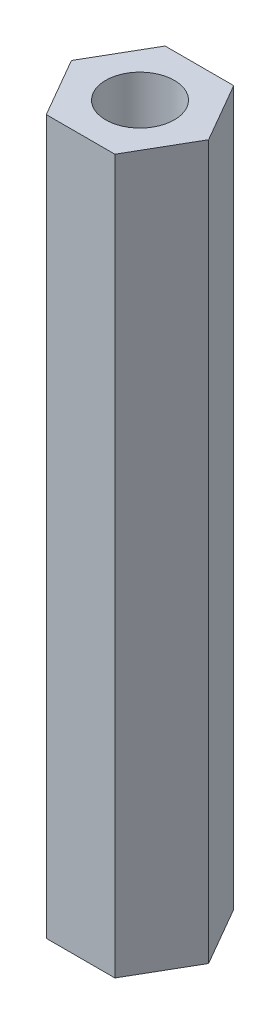
ISO-10303-21;
HEADER;
FILE_DESCRIPTION(('STEP AP214'),'2;1');
FILE_NAME('part.step','',(''),(''),'','','');
FILE_SCHEMA(('AUTOMOTIVE_DESIGN { 1 0 10303 214 1 1 1 1 }'));
ENDSEC;
DATA;
#1=APPLICATION_CONTEXT('core data for automotive mechanical design processes');
#2=APPLICATION_PROTOCOL_DEFINITION('international standard','automotive_design',2000,#1);
#3=PRODUCT_CONTEXT('',#1,'mechanical');
#4=PRODUCT('Part','Part','',(#3));
#5=PRODUCT_RELATED_PRODUCT_CATEGORY('part','',(#4));
#6=PRODUCT_DEFINITION_FORMATION('','',#4);
#7=PRODUCT_DEFINITION_CONTEXT('part definition',#1,'design');
#8=PRODUCT_DEFINITION('design','',#6,#7);
#9=PRODUCT_DEFINITION_SHAPE('','',#8);
#10=(LENGTH_UNIT() NAMED_UNIT(*) SI_UNIT(.MILLI.,.METRE.));
#11=(NAMED_UNIT(*) PLANE_ANGLE_UNIT() SI_UNIT($,.RADIAN.));
#12=(NAMED_UNIT(*) SI_UNIT($,.STERADIAN.) SOLID_ANGLE_UNIT());
#13=UNCERTAINTY_MEASURE_WITH_UNIT(LENGTH_MEASURE(1.E-05),#10,'distance_accuracy_value','');
#14=(GEOMETRIC_REPRESENTATION_CONTEXT(3) GLOBAL_UNCERTAINTY_ASSIGNED_CONTEXT((#13)) GLOBAL_UNIT_ASSIGNED_CONTEXT((#10,
#11,#12)) REPRESENTATION_CONTEXT('',''));
#15=CARTESIAN_POINT('',(0.,0.,0.));
#16=DIRECTION('',(0.,0.,1.));
#17=DIRECTION('',(1.,0.,0.));
#18=AXIS2_PLACEMENT_3D('',#15,#16,#17);
#19=CARTESIAN_POINT('',(0.,13.,0.));
#20=DIRECTION('',(0.,1.,0.));
#21=DIRECTION('',(0.,0.,1.));
#22=AXIS2_PLACEMENT_3D('',#19,#20,#21);
#23=PLANE('',#22);
#24=DIRECTION('',(1.,0.,0.));
#25=VECTOR('',#24,1.);
#26=CARTESIAN_POINT('',(-1.25,13.,2.1650635094611));
#27=LINE('',#26,#25);
#28=CARTESIAN_POINT('',(-1.25,13.,2.1650635094611));
#29=VERTEX_POINT('',#28);
#30=CARTESIAN_POINT('',(1.25,13.,2.1650635094611));
#31=VERTEX_POINT('',#30);
#32=EDGE_CURVE('E130',#29,#31,#27,.T.);
#33=ORIENTED_EDGE('',*,*,#32,.T.);
#34=DIRECTION('',(0.5,0.,-0.866025403784439));
#35=VECTOR('',#34,1.);
#36=CARTESIAN_POINT('',(1.25,13.,2.1650635094611));
#37=LINE('',#36,#35);
#38=CARTESIAN_POINT('',(2.5,13.,0.));
#39=VERTEX_POINT('',#38);
#40=EDGE_CURVE('E88',#31,#39,#37,.T.);
#41=ORIENTED_EDGE('',*,*,#40,.T.);
#42=DIRECTION('',(-0.5,0.,-0.866025403784438));
#43=VECTOR('',#42,1.);
#44=CARTESIAN_POINT('',(2.5,13.,0.));
#45=LINE('',#44,#43);
#46=CARTESIAN_POINT('',(1.25,13.,-2.1650635094611));
#47=VERTEX_POINT('',#46);
#48=EDGE_CURVE('E101',#39,#47,#45,.T.);
#49=ORIENTED_EDGE('',*,*,#48,.T.);
#50=DIRECTION('',(-1.,0.,0.));
#51=VECTOR('',#50,1.);
#52=CARTESIAN_POINT('',(1.25,13.,-2.1650635094611));
#53=LINE('',#52,#51);
#54=CARTESIAN_POINT('',(-1.25,13.,-2.1650635094611));
#55=VERTEX_POINT('',#54);
#56=EDGE_CURVE('E95',#47,#55,#53,.T.);
#57=ORIENTED_EDGE('',*,*,#56,.T.);
#58=DIRECTION('',(-0.5,0.,0.866025403784439));
#59=VECTOR('',#58,1.);
#60=CARTESIAN_POINT('',(-1.25,13.,-2.1650635094611));
#61=LINE('',#60,#59);
#62=CARTESIAN_POINT('',(-2.5,13.,0.));
#63=VERTEX_POINT('',#62);
#64=EDGE_CURVE('E99',#55,#63,#61,.T.);
#65=ORIENTED_EDGE('',*,*,#64,.T.);
#66=DIRECTION('',(0.5,0.,0.866025403784439));
#67=VECTOR('',#66,1.);
#68=CARTESIAN_POINT('',(-2.5,13.,0.));
#69=LINE('',#68,#67);
#70=EDGE_CURVE('E51',#63,#29,#69,.T.);
#71=ORIENTED_EDGE('',*,*,#70,.T.);
#72=EDGE_LOOP('',(#33,#41,#49,#57,#65,#71));
#73=FACE_BOUND('',#72,.T.);
#74=CARTESIAN_POINT('',(0.,13.,0.));
#75=DIRECTION('',(0.,1.,0.));
#76=DIRECTION('',(0.,0.,1.));
#77=AXIS2_PLACEMENT_3D('',#74,#75,#76);
#78=CIRCLE('',#77,1.25);
#79=CARTESIAN_POINT('',(0.,13.,-1.25));
#80=VERTEX_POINT('',#79);
#81=EDGE_CURVE('E123',#80,#80,#78,.T.);
#82=ORIENTED_EDGE('',*,*,#81,.F.);
#83=EDGE_LOOP('',(#82));
#84=FACE_BOUND('',#83,.T.);
#85=ADVANCED_FACE('F34',(#73,#84),#23,.T.);
#86=CARTESIAN_POINT('',(0.,-13.,0.));
#87=DIRECTION('',(0.,1.,0.));
#88=DIRECTION('',(0.,0.,1.));
#89=AXIS2_PLACEMENT_3D('',#86,#87,#88);
#90=PLANE('',#89);
#91=DIRECTION('',(1.,0.,0.));
#92=VECTOR('',#91,1.);
#93=CARTESIAN_POINT('',(-1.25,-13.,2.1650635094611));
#94=LINE('',#93,#92);
#95=CARTESIAN_POINT('',(-1.25,-13.,2.1650635094611));
#96=VERTEX_POINT('',#95);
#97=CARTESIAN_POINT('',(1.25,-13.,2.1650635094611));
#98=VERTEX_POINT('',#97);
#99=EDGE_CURVE('E119',#96,#98,#94,.T.);
#100=ORIENTED_EDGE('',*,*,#99,.F.);
#101=DIRECTION('',(0.5,0.,0.866025403784439));
#102=VECTOR('',#101,1.);
#103=CARTESIAN_POINT('',(-2.5,-13.,0.));
#104=LINE('',#103,#102);
#105=CARTESIAN_POINT('',(-2.5,-13.,0.));
#106=VERTEX_POINT('',#105);
#107=EDGE_CURVE('E80',#106,#96,#104,.T.);
#108=ORIENTED_EDGE('',*,*,#107,.F.);
#109=DIRECTION('',(-0.5,0.,0.866025403784439));
#110=VECTOR('',#109,1.);
#111=CARTESIAN_POINT('',(-1.25,-13.,-2.1650635094611));
#112=LINE('',#111,#110);
#113=CARTESIAN_POINT('',(-1.25,-13.,-2.1650635094611));
#114=VERTEX_POINT('',#113);
#115=EDGE_CURVE('E74',#114,#106,#112,.T.);
#116=ORIENTED_EDGE('',*,*,#115,.F.);
#117=DIRECTION('',(-1.,0.,0.));
#118=VECTOR('',#117,1.);
#119=CARTESIAN_POINT('',(1.25,-13.,-2.1650635094611));
#120=LINE('',#119,#118);
#121=CARTESIAN_POINT('',(1.25,-13.,-2.1650635094611));
#122=VERTEX_POINT('',#121);
#123=EDGE_CURVE('E109',#122,#114,#120,.T.);
#124=ORIENTED_EDGE('',*,*,#123,.F.);
#125=DIRECTION('',(-0.5,0.,-0.866025403784438));
#126=VECTOR('',#125,1.);
#127=CARTESIAN_POINT('',(2.5,-13.,0.));
#128=LINE('',#127,#126);
#129=CARTESIAN_POINT('',(2.5,-13.,0.));
#130=VERTEX_POINT('',#129);
#131=EDGE_CURVE('E125',#130,#122,#128,.T.);
#132=ORIENTED_EDGE('',*,*,#131,.F.);
#133=DIRECTION('',(0.5,0.,-0.866025403784439));
#134=VECTOR('',#133,1.);
#135=CARTESIAN_POINT('',(1.25,-13.,2.1650635094611));
#136=LINE('',#135,#134);
#137=EDGE_CURVE('E122',#98,#130,#136,.T.);
#138=ORIENTED_EDGE('',*,*,#137,.F.);
#139=EDGE_LOOP('',(#100,#108,#116,#124,#132,#138));
#140=FACE_BOUND('',#139,.T.);
#141=CARTESIAN_POINT('',(0.,-13.,0.));
#142=DIRECTION('',(0.,1.,0.));
#143=DIRECTION('',(0.,0.,1.));
#144=AXIS2_PLACEMENT_3D('',#141,#142,#143);
#145=CIRCLE('',#144,1.25);
#146=CARTESIAN_POINT('',(0.,-13.,-1.25));
#147=VERTEX_POINT('',#146);
#148=EDGE_CURVE('E223',#147,#147,#145,.T.);
#149=ORIENTED_EDGE('',*,*,#148,.T.);
#150=EDGE_LOOP('',(#149));
#151=FACE_BOUND('',#150,.T.);
#152=ADVANCED_FACE('F139',(#140,#151),#90,.F.);
#153=CARTESIAN_POINT('',(-1.25,13.,2.1650635094611));
#154=DIRECTION('',(0.,0.,-1.));
#155=DIRECTION('',(-1.,0.,0.));
#156=AXIS2_PLACEMENT_3D('',#153,#154,#155);
#157=PLANE('',#156);
#158=ORIENTED_EDGE('',*,*,#99,.T.);
#159=DIRECTION('',(0.,-1.,0.));
#160=VECTOR('',#159,1.);
#161=CARTESIAN_POINT('',(1.25,13.,2.1650635094611));
#162=LINE('',#161,#160);
#163=EDGE_CURVE('E11',#31,#98,#162,.T.);
#164=ORIENTED_EDGE('',*,*,#163,.F.);
#165=ORIENTED_EDGE('',*,*,#32,.F.);
#166=DIRECTION('',(0.,-1.,0.));
#167=VECTOR('',#166,1.);
#168=CARTESIAN_POINT('',(-1.25,13.,2.1650635094611));
#169=LINE('',#168,#167);
#170=EDGE_CURVE('E115',#29,#96,#169,.T.);
#171=ORIENTED_EDGE('',*,*,#170,.T.);
#172=EDGE_LOOP('',(#158,#164,#165,#171));
#173=FACE_BOUND('',#172,.T.);
#174=ADVANCED_FACE('F36',(#173),#157,.F.);
#175=CARTESIAN_POINT('',(1.25,13.,2.1650635094611));
#176=DIRECTION('',(-0.866025403784438,0.,-0.5));
#177=DIRECTION('',(-0.5,0.,0.866025403784439));
#178=AXIS2_PLACEMENT_3D('',#175,#176,#177);
#179=PLANE('',#178);
#180=ORIENTED_EDGE('',*,*,#137,.T.);
#181=DIRECTION('',(0.,-1.,0.));
#182=VECTOR('',#181,1.);
#183=CARTESIAN_POINT('',(2.5,13.,0.));
#184=LINE('',#183,#182);
#185=EDGE_CURVE('E43',#39,#130,#184,.T.);
#186=ORIENTED_EDGE('',*,*,#185,.F.);
#187=ORIENTED_EDGE('',*,*,#40,.F.);
#188=ORIENTED_EDGE('',*,*,#163,.T.);
#189=EDGE_LOOP('',(#180,#186,#187,#188));
#190=FACE_BOUND('',#189,.T.);
#191=ADVANCED_FACE('F164',(#190),#179,.F.);
#192=CARTESIAN_POINT('',(2.5,13.,0.));
#193=DIRECTION('',(-0.866025403784438,0.,0.5));
#194=DIRECTION('',(0.5,0.,0.866025403784439));
#195=AXIS2_PLACEMENT_3D('',#192,#193,#194);
#196=PLANE('',#195);
#197=ORIENTED_EDGE('',*,*,#131,.T.);
#198=DIRECTION('',(0.,-1.,0.));
#199=VECTOR('',#198,1.);
#200=CARTESIAN_POINT('',(1.25,13.,-2.1650635094611));
#201=LINE('',#200,#199);
#202=EDGE_CURVE('E110',#47,#122,#201,.T.);
#203=ORIENTED_EDGE('',*,*,#202,.F.);
#204=ORIENTED_EDGE('',*,*,#48,.F.);
#205=ORIENTED_EDGE('',*,*,#185,.T.);
#206=EDGE_LOOP('',(#197,#203,#204,#205));
#207=FACE_BOUND('',#206,.T.);
#208=ADVANCED_FACE('F136',(#207),#196,.F.);
#209=CARTESIAN_POINT('',(1.25,13.,-2.1650635094611));
#210=DIRECTION('',(0.,0.,1.));
#211=DIRECTION('',(1.,0.,0.));
#212=AXIS2_PLACEMENT_3D('',#209,#210,#211);
#213=PLANE('',#212);
#214=ORIENTED_EDGE('',*,*,#123,.T.);
#215=DIRECTION('',(0.,-1.,0.));
#216=VECTOR('',#215,1.);
#217=CARTESIAN_POINT('',(-1.25,13.,-2.1650635094611));
#218=LINE('',#217,#216);
#219=EDGE_CURVE('E106',#55,#114,#218,.T.);
#220=ORIENTED_EDGE('',*,*,#219,.F.);
#221=ORIENTED_EDGE('',*,*,#56,.F.);
#222=ORIENTED_EDGE('',*,*,#202,.T.);
#223=EDGE_LOOP('',(#214,#220,#221,#222));
#224=FACE_BOUND('',#223,.T.);
#225=ADVANCED_FACE('F107',(#224),#213,.F.);
#226=CARTESIAN_POINT('',(-1.25,13.,-2.1650635094611));
#227=DIRECTION('',(0.866025403784439,0.,0.5));
#228=DIRECTION('',(0.5,0.,-0.866025403784439));
#229=AXIS2_PLACEMENT_3D('',#226,#227,#228);
#230=PLANE('',#229);
#231=ORIENTED_EDGE('',*,*,#115,.T.);
#232=DIRECTION('',(0.,-1.,0.));
#233=VECTOR('',#232,1.);
#234=CARTESIAN_POINT('',(-2.5,13.,0.));
#235=LINE('',#234,#233);
#236=EDGE_CURVE('E111',#63,#106,#235,.T.);
#237=ORIENTED_EDGE('',*,*,#236,.F.);
#238=ORIENTED_EDGE('',*,*,#64,.F.);
#239=ORIENTED_EDGE('',*,*,#219,.T.);
#240=EDGE_LOOP('',(#231,#237,#238,#239));
#241=FACE_BOUND('',#240,.T.);
#242=ADVANCED_FACE('F113',(#241),#230,.F.);
#243=CARTESIAN_POINT('',(-2.5,13.,0.));
#244=DIRECTION('',(0.866025403784438,0.,-0.5));
#245=DIRECTION('',(-0.5,0.,-0.866025403784439));
#246=AXIS2_PLACEMENT_3D('',#243,#244,#245);
#247=PLANE('',#246);
#248=ORIENTED_EDGE('',*,*,#107,.T.);
#249=ORIENTED_EDGE('',*,*,#170,.F.);
#250=ORIENTED_EDGE('',*,*,#70,.F.);
#251=ORIENTED_EDGE('',*,*,#236,.T.);
#252=EDGE_LOOP('',(#248,#249,#250,#251));
#253=FACE_BOUND('',#252,.T.);
#254=ADVANCED_FACE('F144',(#253),#247,.F.);
#255=CARTESIAN_POINT('',(0.,13.,0.));
#256=DIRECTION('',(0.,-1.,0.));
#257=DIRECTION('',(0.,0.,-1.));
#258=AXIS2_PLACEMENT_3D('',#255,#256,#257);
#259=CYLINDRICAL_SURFACE('',#258,1.25);
#260=CARTESIAN_POINT('',(0.,13.,-1.25));
#261=CARTESIAN_POINT('',(0.,12.7291666666667,-1.25));
#262=CARTESIAN_POINT('',(0.,12.4583333333333,-1.25));
#263=CARTESIAN_POINT('',(0.,11.9166666666667,-1.25));
#264=CARTESIAN_POINT('',(0.,11.6458333333333,-1.25));
#265=CARTESIAN_POINT('',(0.,11.1041666666667,-1.25));
#266=CARTESIAN_POINT('',(0.,10.8333333333333,-1.25));
#267=CARTESIAN_POINT('',(0.,10.2916666666667,-1.25));
#268=CARTESIAN_POINT('',(0.,10.0208333333333,-1.25));
#269=CARTESIAN_POINT('',(0.,9.47916666666667,-1.25));
#270=CARTESIAN_POINT('',(0.,9.20833333333333,-1.25));
#271=CARTESIAN_POINT('',(0.,8.66666666666667,-1.25));
#272=CARTESIAN_POINT('',(0.,8.39583333333333,-1.25));
#273=CARTESIAN_POINT('',(0.,7.85416666666667,-1.25));
#274=CARTESIAN_POINT('',(0.,7.58333333333333,-1.25));
#275=CARTESIAN_POINT('',(0.,7.04166666666667,-1.25));
#276=CARTESIAN_POINT('',(0.,6.77083333333333,-1.25));
#277=CARTESIAN_POINT('',(0.,6.22916666666667,-1.25));
#278=CARTESIAN_POINT('',(0.,5.95833333333333,-1.25));
#279=CARTESIAN_POINT('',(0.,5.41666666666667,-1.25));
#280=CARTESIAN_POINT('',(0.,5.14583333333333,-1.25));
#281=CARTESIAN_POINT('',(0.,4.60416666666667,-1.25));
#282=CARTESIAN_POINT('',(0.,4.33333333333333,-1.25));
#283=CARTESIAN_POINT('',(0.,3.79166666666667,-1.25));
#284=CARTESIAN_POINT('',(0.,3.52083333333333,-1.25));
#285=CARTESIAN_POINT('',(0.,2.97916666666667,-1.25));
#286=CARTESIAN_POINT('',(0.,2.70833333333333,-1.25));
#287=CARTESIAN_POINT('',(0.,2.16666666666667,-1.25));
#288=CARTESIAN_POINT('',(0.,1.89583333333333,-1.25));
#289=CARTESIAN_POINT('',(0.,1.35416666666667,-1.25));
#290=CARTESIAN_POINT('',(0.,1.08333333333333,-1.25));
#291=CARTESIAN_POINT('',(0.,0.541666666666667,-1.25));
#292=CARTESIAN_POINT('',(0.,0.270833333333333,-1.25));
#293=CARTESIAN_POINT('',(0.,-0.270833333333333,-1.25));
#294=CARTESIAN_POINT('',(0.,-0.541666666666667,-1.25));
#295=CARTESIAN_POINT('',(0.,-1.08333333333333,-1.25));
#296=CARTESIAN_POINT('',(0.,-1.35416666666667,-1.25));
#297=CARTESIAN_POINT('',(0.,-1.89583333333333,-1.25));
#298=CARTESIAN_POINT('',(0.,-2.16666666666667,-1.25));
#299=CARTESIAN_POINT('',(0.,-2.70833333333333,-1.25));
#300=CARTESIAN_POINT('',(0.,-2.97916666666667,-1.25));
#301=CARTESIAN_POINT('',(0.,-3.52083333333333,-1.25));
#302=CARTESIAN_POINT('',(0.,-3.79166666666667,-1.25));
#303=CARTESIAN_POINT('',(0.,-4.33333333333333,-1.25));
#304=CARTESIAN_POINT('',(0.,-4.60416666666667,-1.25));
#305=CARTESIAN_POINT('',(0.,-5.14583333333333,-1.25));
#306=CARTESIAN_POINT('',(0.,-5.41666666666667,-1.25));
#307=CARTESIAN_POINT('',(0.,-5.95833333333333,-1.25));
#308=CARTESIAN_POINT('',(0.,-6.22916666666667,-1.25));
#309=CARTESIAN_POINT('',(0.,-6.77083333333333,-1.25));
#310=CARTESIAN_POINT('',(0.,-7.04166666666667,-1.25));
#311=CARTESIAN_POINT('',(0.,-7.58333333333333,-1.25));
#312=CARTESIAN_POINT('',(0.,-7.85416666666667,-1.25));
#313=CARTESIAN_POINT('',(0.,-8.39583333333333,-1.25));
#314=CARTESIAN_POINT('',(0.,-8.66666666666667,-1.25));
#315=CARTESIAN_POINT('',(0.,-9.20833333333333,-1.25));
#316=CARTESIAN_POINT('',(0.,-9.47916666666667,-1.25));
#317=CARTESIAN_POINT('',(0.,-10.0208333333333,-1.25));
#318=CARTESIAN_POINT('',(0.,-10.2916666666667,-1.25));
#319=CARTESIAN_POINT('',(0.,-10.8333333333333,-1.25));
#320=CARTESIAN_POINT('',(0.,-11.1041666666667,-1.25));
#321=CARTESIAN_POINT('',(0.,-11.6458333333333,-1.25));
#322=CARTESIAN_POINT('',(0.,-11.9166666666667,-1.25));
#323=CARTESIAN_POINT('',(0.,-12.4583333333333,-1.25));
#324=CARTESIAN_POINT('',(0.,-12.7291666666667,-1.25));
#325=CARTESIAN_POINT('',(0.,-13.,-1.25));
#326=B_SPLINE_CURVE_WITH_KNOTS('',3,(#260,#261,#262,#263,#264,#265,#266,#267,#268,#269,#270,
#271,#272,#273,#274,#275,#276,#277,#278,#279,#280,#281,#282,#283,#284,#285,#286,#287,#288,#289,
#290,#291,#292,#293,#294,#295,#296,#297,#298,#299,#300,#301,#302,#303,#304,#305,#306,#307,#308,
#309,#310,#311,#312,#313,#314,#315,#316,#317,#318,#319,#320,#321,#322,#323,#324,#325),
.UNSPECIFIED.,.F.,.F.,(4,2,2,2,2,2,2,2,2,2,2,2,2,2,2,2,2,2,2,2,2,2,2,2,2,2,2,2,2,2,2,2,4),(0.,
0.812500000000001,1.625,2.4375,3.25,4.0625,4.875,5.6875,6.5,7.3125,8.125,8.9375,9.75,10.5625,
11.375,12.1875,13.,13.8125,14.625,15.4375,16.25,17.0625,17.875,18.6875,19.5,20.3125,21.125,
21.9375,22.75,23.5625,24.375,25.1875,26.),.UNSPECIFIED.);
#327=EDGE_CURVE('BSEAM146',#80,#147,#326,.T.);
#328=ORIENTED_EDGE('',*,*,#81,.T.);
#329=ORIENTED_EDGE('',*,*,#148,.F.);
#330=ORIENTED_EDGE('',*,*,#327,.T.);
#331=ORIENTED_EDGE('',*,*,#327,.F.);
#332=EDGE_LOOP('',(#328,#330,#329,#331));
#333=FACE_BOUND('',#332,.T.);
#334=ADVANCED_FACE('F146',(#333),#259,.F.);
#335=CLOSED_SHELL('',(#85,#152,#174,#191,#208,#225,#242,#254,#334));
#336=MANIFOLD_SOLID_BREP('B2',#335);
#337=ADVANCED_BREP_SHAPE_REPRESENTATION('',(#18,#336),#14);
#338=SHAPE_DEFINITION_REPRESENTATION(#9,#337);
ENDSEC;
END-ISO-10303-21;
